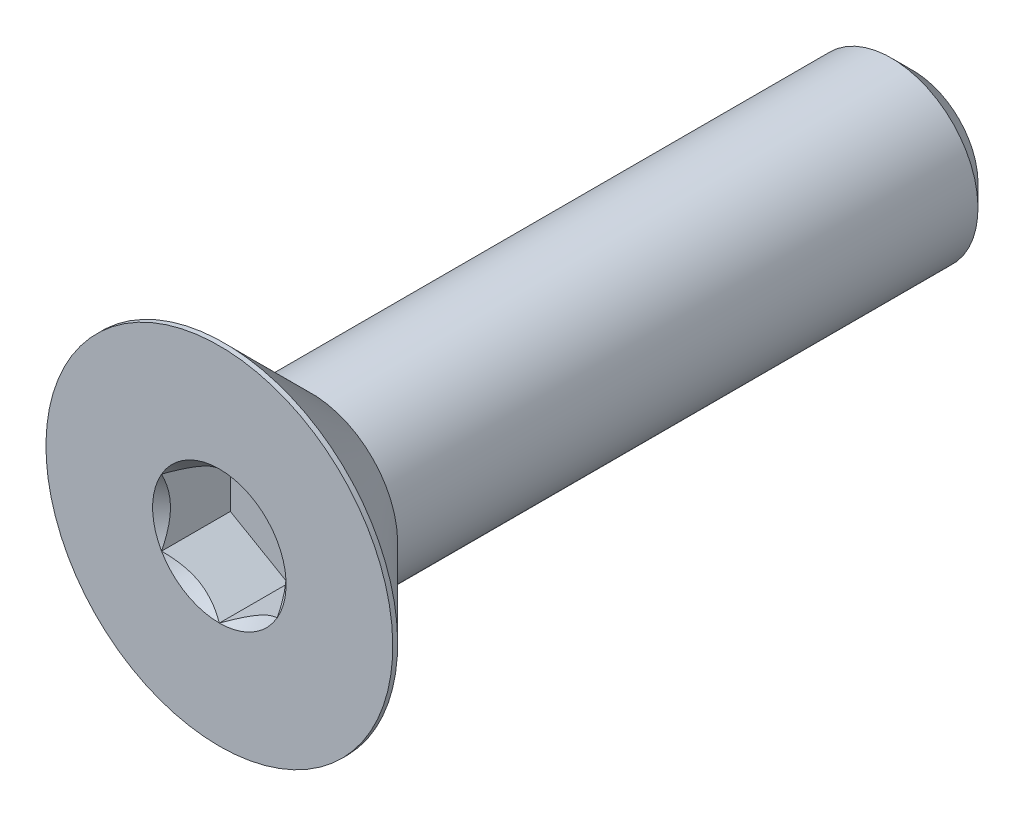
ISO-10303-21;
HEADER;
FILE_DESCRIPTION(('STEP AP214'),'2;1');
FILE_NAME('part.step','',(''),(''),'','','');
FILE_SCHEMA(('AUTOMOTIVE_DESIGN { 1 0 10303 214 1 1 1 1 }'));
ENDSEC;
DATA;
#1=APPLICATION_CONTEXT('core data for automotive mechanical design processes');
#2=APPLICATION_PROTOCOL_DEFINITION('international standard','automotive_design',2000,#1);
#3=PRODUCT_CONTEXT('',#1,'mechanical');
#4=PRODUCT('Part','Part','',(#3));
#5=PRODUCT_RELATED_PRODUCT_CATEGORY('part','',(#4));
#6=PRODUCT_DEFINITION_FORMATION('','',#4);
#7=PRODUCT_DEFINITION_CONTEXT('part definition',#1,'design');
#8=PRODUCT_DEFINITION('design','',#6,#7);
#9=PRODUCT_DEFINITION_SHAPE('','',#8);
#10=(LENGTH_UNIT() NAMED_UNIT(*) SI_UNIT(.MILLI.,.METRE.));
#11=(NAMED_UNIT(*) PLANE_ANGLE_UNIT() SI_UNIT($,.RADIAN.));
#12=(NAMED_UNIT(*) SI_UNIT($,.STERADIAN.) SOLID_ANGLE_UNIT());
#13=UNCERTAINTY_MEASURE_WITH_UNIT(LENGTH_MEASURE(1.E-05),#10,'distance_accuracy_value','');
#14=(GEOMETRIC_REPRESENTATION_CONTEXT(3) GLOBAL_UNCERTAINTY_ASSIGNED_CONTEXT((#13)) GLOBAL_UNIT_ASSIGNED_CONTEXT((#10,
#11,#12)) REPRESENTATION_CONTEXT('',''));
#15=CARTESIAN_POINT('',(0.,0.,0.));
#16=DIRECTION('',(0.,0.,1.));
#17=DIRECTION('',(1.,0.,0.));
#18=AXIS2_PLACEMENT_3D('',#15,#16,#17);
#19=CARTESIAN_POINT('',(0.,0.,5.915));
#20=DIRECTION('',(0.,0.,1.));
#21=DIRECTION('',(0.,-1.,0.));
#22=AXIS2_PLACEMENT_3D('',#19,#20,#21);
#23=CONICAL_SURFACE('',#22,3.,0.785398163397448);
#24=CARTESIAN_POINT('',(0.,0.,5.915));
#25=DIRECTION('',(0.,0.,1.));
#26=DIRECTION('',(0.,-1.,0.));
#27=AXIS2_PLACEMENT_3D('',#24,#25,#26);
#28=CIRCLE('',#27,3.);
#29=CARTESIAN_POINT('',(0.,-3.,5.915));
#30=VERTEX_POINT('',#29);
#31=EDGE_CURVE('E51',#30,#30,#28,.T.);
#32=ORIENTED_EDGE('',*,*,#31,.F.);
#33=EDGE_LOOP('',(#32));
#34=FACE_BOUND('',#33,.T.);
#35=CARTESIAN_POINT('',(0.,0.,4.415));
#36=DIRECTION('',(0.,0.,1.));
#37=DIRECTION('',(0.,-1.,0.));
#38=AXIS2_PLACEMENT_3D('',#35,#36,#37);
#39=CIRCLE('',#38,1.50000000000001);
#40=CARTESIAN_POINT('',(0.,-1.50000000000001,4.415));
#41=VERTEX_POINT('',#40);
#42=EDGE_CURVE('E46',#41,#41,#39,.T.);
#43=ORIENTED_EDGE('',*,*,#42,.T.);
#44=EDGE_LOOP('',(#43));
#45=FACE_BOUND('',#44,.T.);
#46=ADVANCED_FACE('F43',(#34,#45),#23,.T.);
#47=CARTESIAN_POINT('',(0.,0.,6.));
#48=DIRECTION('',(0.,0.,-1.));
#49=DIRECTION('',(0.,1.,0.));
#50=AXIS2_PLACEMENT_3D('',#47,#48,#49);
#51=PLANE('',#50);
#52=CARTESIAN_POINT('',(0.,0.,6.));
#53=DIRECTION('',(0.,0.,1.));
#54=DIRECTION('',(0.,-1.,0.));
#55=AXIS2_PLACEMENT_3D('',#52,#53,#54);
#56=CIRCLE('',#55,3.);
#57=CARTESIAN_POINT('',(0.,-3.,6.));
#58=VERTEX_POINT('',#57);
#59=EDGE_CURVE('E258',#58,#58,#56,.T.);
#60=ORIENTED_EDGE('',*,*,#59,.T.);
#61=EDGE_LOOP('',(#60));
#62=FACE_BOUND('',#61,.T.);
#63=CARTESIAN_POINT('',(0.,0.,6.));
#64=DIRECTION('',(0.,0.,-1.));
#65=DIRECTION('',(-1.,0.,0.));
#66=AXIS2_PLACEMENT_3D('',#63,#64,#65);
#67=CIRCLE('',#66,1.15470053837925);
#68=CARTESIAN_POINT('',(-1.,0.577350269189622,6.));
#69=VERTEX_POINT('',#68);
#70=CARTESIAN_POINT('',(0.,1.15470053837925,6.));
#71=VERTEX_POINT('',#70);
#72=EDGE_CURVE('E133',#69,#71,#67,.T.);
#73=ORIENTED_EDGE('',*,*,#72,.T.);
#74=CARTESIAN_POINT('',(1.,0.577350269189625,6.));
#75=VERTEX_POINT('',#74);
#76=EDGE_CURVE('E132',#71,#75,#67,.T.);
#77=ORIENTED_EDGE('',*,*,#76,.T.);
#78=CARTESIAN_POINT('',(1.,-0.577350269189626,6.));
#79=VERTEX_POINT('',#78);
#80=EDGE_CURVE('E103',#75,#79,#67,.T.);
#81=ORIENTED_EDGE('',*,*,#80,.T.);
#82=CARTESIAN_POINT('',(0.,-1.15470053837925,6.));
#83=VERTEX_POINT('',#82);
#84=EDGE_CURVE('E96',#79,#83,#67,.T.);
#85=ORIENTED_EDGE('',*,*,#84,.T.);
#86=CARTESIAN_POINT('',(-1.,-0.577350269189627,6.));
#87=VERTEX_POINT('',#86);
#88=EDGE_CURVE('E57',#83,#87,#67,.T.);
#89=ORIENTED_EDGE('',*,*,#88,.T.);
#90=EDGE_CURVE('E64',#87,#69,#67,.T.);
#91=ORIENTED_EDGE('',*,*,#90,.T.);
#92=EDGE_LOOP('',(#73,#77,#81,#85,#89,#91));
#93=FACE_BOUND('',#92,.T.);
#94=ADVANCED_FACE('F131',(#62,#93),#51,.F.);
#95=CARTESIAN_POINT('',(0.,0.,6.));
#96=DIRECTION('',(0.,0.,1.));
#97=DIRECTION('',(0.,-1.,0.));
#98=AXIS2_PLACEMENT_3D('',#95,#96,#97);
#99=CYLINDRICAL_SURFACE('',#98,3.);
#100=ORIENTED_EDGE('',*,*,#31,.T.);
#101=EDGE_LOOP('',(#100));
#102=FACE_BOUND('',#101,.T.);
#103=ORIENTED_EDGE('',*,*,#59,.F.);
#104=EDGE_LOOP('',(#103));
#105=FACE_BOUND('',#104,.T.);
#106=ADVANCED_FACE('F214',(#102,#105),#99,.T.);
#107=CARTESIAN_POINT('',(0.,0.,6.));
#108=DIRECTION('',(0.,0.,1.));
#109=DIRECTION('',(-1.,0.,0.));
#110=AXIS2_PLACEMENT_3D('',#107,#108,#109);
#111=CONICAL_SURFACE('',#110,1.15470053837925,0.78539816339745);
#112=CARTESIAN_POINT('',(1.,-1.15147208663215,6.37038567764035));
#113=CARTESIAN_POINT('',(1.,-1.12343448004835,6.34921991999533));
#114=CARTESIAN_POINT('',(1.,-1.09524064866509,6.32826169229267));
#115=CARTESIAN_POINT('',(1.,-1.0384771565924,6.28684602234268));
#116=CARTESIAN_POINT('',(1.,-1.00990740397363,6.26638870622588));
#117=CARTESIAN_POINT('',(1.,-0.923120894462778,6.20560479504213));
#118=CARTESIAN_POINT('',(1.,-0.864253173878447,6.16619222903932));
#119=CARTESIAN_POINT('',(1.,-0.740809858355813,6.08882066425819));
#120=CARTESIAN_POINT('',(1.,-0.67610025522381,6.05107303916216));
#121=CARTESIAN_POINT('',(1.,-0.543448939110599,5.98202458758025));
#122=CARTESIAN_POINT('',(1.,-0.475519112076497,5.95070202786713));
#123=CARTESIAN_POINT('',(1.,-0.373555850372649,5.9123817788976));
#124=CARTESIAN_POINT('',(1.,-0.341031989714047,5.90138359165621));
#125=CARTESIAN_POINT('',(1.,-0.275199079103602,5.88199834216111));
#126=CARTESIAN_POINT('',(1.,-0.241889975229392,5.87361145978989));
#127=CARTESIAN_POINT('',(1.,-0.175247517106615,5.86002522073014));
#128=CARTESIAN_POINT('',(1.,-0.141925568285808,5.85477079077761));
#129=CARTESIAN_POINT('',(1.,-0.0749144363078012,5.84754868657667));
#130=CARTESIAN_POINT('',(1.,-0.0412251979295628,5.8455815136139));
#131=CARTESIAN_POINT('',(1.,0.0249580991768643,5.84508319839111));
#132=CARTESIAN_POINT('',(1.,0.0574512825561959,5.84643026788357));
#133=CARTESIAN_POINT('',(1.,0.122148505605779,5.85221648448742));
#134=CARTESIAN_POINT('',(1.,0.154352610033881,5.85665492064648));
#135=CARTESIAN_POINT('',(1.,0.218799898762755,5.86845683012285));
#136=CARTESIAN_POINT('',(1.,0.251033743161196,5.87587054101231));
#137=CARTESIAN_POINT('',(1.,0.314797132241694,5.89322894246471));
#138=CARTESIAN_POINT('',(1.,0.346326735615184,5.90317342125094));
#139=CARTESIAN_POINT('',(1.,0.445594187589165,5.93822348249794));
#140=CARTESIAN_POINT('',(1.,0.511919139313636,5.9673208582833));
#141=CARTESIAN_POINT('',(1.,0.64145324445405,6.03201532957714));
#142=CARTESIAN_POINT('',(1.,0.704650132903152,6.06763577658696));
#143=CARTESIAN_POINT('',(1.,0.825428489916357,6.14112390118245));
#144=CARTESIAN_POINT('',(1.,0.883132947593202,6.17879194695385));
#145=CARTESIAN_POINT('',(1.,0.968148853406642,6.23702285273595));
#146=CARTESIAN_POINT('',(1.,0.996120570074661,6.25663847554718));
#147=CARTESIAN_POINT('',(1.,1.05168177697804,6.29638851682867));
#148=CARTESIAN_POINT('',(1.,1.07927136964838,6.31652279195777));
#149=CARTESIAN_POINT('',(1.,1.10670185312703,6.33687211882347));
#150=B_SPLINE_CURVE_WITH_KNOTS('',3,(#112,#113,#114,#115,#116,#117,#118,#119,#120,#121,#122,
#123,#124,#125,#126,#127,#128,#129,#130,#131,#132,#133,#134,#135,#136,#137,#138,#139,#140,#141,
#142,#143,#144,#145,#146,#147,#148,#149),.UNSPECIFIED.,.F.,.F.,(4,2,2,2,2,2,2,2,2,2,2,2,2,2,2,2,
2,2,4),(0.,0.10538645910335,0.210799187370249,0.423233611646474,0.647793541035353,
0.871580877910868,0.974493074342057,1.07741235842105,1.17846428216996,1.2795316142844,
1.3769408675127,1.47432772596047,1.57343322813835,1.67253043981296,1.88917353997386,
2.10660791031434,2.31323734235672,2.41572589214524,2.51818641455633),.UNSPECIFIED.);
#151=EDGE_CURVE('E11',#75,#79,#150,.F.);
#152=ORIENTED_EDGE('',*,*,#151,.T.);
#153=ORIENTED_EDGE('',*,*,#80,.F.);
#154=EDGE_LOOP('',(#152,#153));
#155=FACE_BOUND('',#154,.T.);
#156=ADVANCED_FACE('F108',(#155),#111,.F.);
#157=CARTESIAN_POINT('',(-0.000199999999999653,1.15481600843309,6.00011548737261));
#158=CARTESIAN_POINT('',(0.0341825950071809,1.13496520795026,5.98027793082573));
#159=CARTESIAN_POINT('',(0.0691401181398251,1.11478247255942,5.96160502063888));
#160=CARTESIAN_POINT('',(0.14042280295609,1.07362739529219,5.92741474272315));
#161=CARTESIAN_POINT('',(0.176754750528985,1.0526511355808,5.91191640902345));
#162=CARTESIAN_POINT('',(0.250016613803312,1.01035337909803,5.88536730714226));
#163=CARTESIAN_POINT('',(0.286927851445415,0.98904266610924,5.87424977399692));
#164=CARTESIAN_POINT('',(0.36156272931086,0.945952199282691,5.85711986577618));
#165=CARTESIAN_POINT('',(0.399284088108636,0.924173762626596,5.85109469746667));
#166=CARTESIAN_POINT('',(0.464292198417934,0.886641312640014,5.84566055496749));
#167=CARTESIAN_POINT('',(0.491494371528173,0.870936130672275,5.84485693831673));
#168=CARTESIAN_POINT('',(0.545846040669113,0.839556179862848,5.84620669941688));
#169=CARTESIAN_POINT('',(0.572995523754877,0.823881418494923,5.8483607295472));
#170=CARTESIAN_POINT('',(0.654056277326961,0.777080970599366,5.85911697212847));
#171=CARTESIAN_POINT('',(0.707564140978428,0.74618819111643,5.87201455641535));
#172=CARTESIAN_POINT('',(0.801476065143433,0.691968116419649,5.90314073060217));
#173=CARTESIAN_POINT('',(0.842320523671835,0.668386557293371,5.91973779770184));
#174=CARTESIAN_POINT('',(0.922409637381945,0.622147085933681,5.95712492468529));
#175=CARTESIAN_POINT('',(0.961659010870439,0.599486449584575,5.9779013418174));
#176=CARTESIAN_POINT('',(1.0002,0.577234799135787,6.00011548737261));
#177=B_SPLINE_CURVE_WITH_KNOTS('',3,(#157,#158,#159,#160,#161,#162,#163,#164,#165,#166,#167,
#168,#169,#170,#171,#172,#173,#174,#175,#176),.UNSPECIFIED.,.F.,.F.,(4,2,2,2,2,2,2,2,2,4),(0.,
0.133237676828559,0.26725222983449,0.3991370762693,0.530689603280768,0.624814864263846,
0.718960890149133,0.907306626112098,1.05710100361789,1.20641411519286),.UNSPECIFIED.);
#178=EDGE_CURVE('E136',#71,#75,#177,.T.);
#179=ORIENTED_EDGE('',*,*,#178,.T.);
#180=ORIENTED_EDGE('',*,*,#76,.F.);
#181=EDGE_LOOP('',(#179,#180));
#182=FACE_BOUND('',#181,.T.);
#183=ADVANCED_FACE('F254',(#182),#111,.F.);
#184=CARTESIAN_POINT('',(-1.0002,0.577234799135787,6.00011548737261));
#185=CARTESIAN_POINT('',(-0.96581740499282,0.59708559961862,5.98027793082573));
#186=CARTESIAN_POINT('',(-0.930859881860176,0.617268335009455,5.96160502063889));
#187=CARTESIAN_POINT('',(-0.859577197043911,0.658423412276685,5.92741474272315));
#188=CARTESIAN_POINT('',(-0.823245249471017,0.679399671988079,5.91191640902345));
#189=CARTESIAN_POINT('',(-0.74998338619669,0.721697428470845,5.88536730714226));
#190=CARTESIAN_POINT('',(-0.713072148554586,0.743008141459636,5.87424977399692));
#191=CARTESIAN_POINT('',(-0.638437270689141,0.786098608286185,5.85711986577618));
#192=CARTESIAN_POINT('',(-0.600715911891364,0.80787704494228,5.85109469746667));
#193=CARTESIAN_POINT('',(-0.535707801582067,0.845409494928862,5.84566055496749));
#194=CARTESIAN_POINT('',(-0.508505628471828,0.861114676896601,5.84485693831673));
#195=CARTESIAN_POINT('',(-0.454153959330888,0.892494627706028,5.84620669941688));
#196=CARTESIAN_POINT('',(-0.427004476245124,0.908169389073953,5.84836072954719));
#197=CARTESIAN_POINT('',(-0.34594372267304,0.95496983696951,5.85911697212847));
#198=CARTESIAN_POINT('',(-0.292435859021573,0.985862616452446,5.87201455641535));
#199=CARTESIAN_POINT('',(-0.198523934856569,1.04008269114923,5.90314073060217));
#200=CARTESIAN_POINT('',(-0.157679476328166,1.06366425027551,5.91973779770183));
#201=CARTESIAN_POINT('',(-0.0775903626180563,1.1099037216352,5.95712492468529));
#202=CARTESIAN_POINT('',(-0.0383409891295621,1.1325643579843,5.9779013418174));
#203=CARTESIAN_POINT('',(0.00020000000000031,1.15481600843309,6.00011548737261));
#204=B_SPLINE_CURVE_WITH_KNOTS('',3,(#184,#185,#186,#187,#188,#189,#190,#191,#192,#193,#194,
#195,#196,#197,#198,#199,#200,#201,#202,#203),.UNSPECIFIED.,.F.,.F.,(4,2,2,2,2,2,2,2,2,4),(0.,
0.13323767682856,0.267252229834491,0.399137076269301,0.53068960328077,0.624814864263848,
0.718960890149135,0.907306626112099,1.0571010036179,1.20641411519286),.UNSPECIFIED.);
#205=EDGE_CURVE('E146',#69,#71,#204,.T.);
#206=ORIENTED_EDGE('',*,*,#205,.T.);
#207=ORIENTED_EDGE('',*,*,#72,.F.);
#208=EDGE_LOOP('',(#206,#207));
#209=FACE_BOUND('',#208,.T.);
#210=ADVANCED_FACE('F290',(#209),#111,.F.);
#211=CARTESIAN_POINT('',(-1.,-1.15147208646462,6.37038567751386));
#212=CARTESIAN_POINT('',(-1.,-1.12343447988552,6.34921991987371));
#213=CARTESIAN_POINT('',(-1.,-1.09524064850698,6.32826169217591));
#214=CARTESIAN_POINT('',(-1.,-1.03847715644377,6.28684602223562));
#215=CARTESIAN_POINT('',(-1.,-1.00990740382975,6.26638870612366));
#216=CARTESIAN_POINT('',(-1.,-0.923120894333482,6.20560479495451));
#217=CARTESIAN_POINT('',(-1.,-0.864253173759064,6.1661922289614));
#218=CARTESIAN_POINT('',(-1.,-0.740809858258049,6.08882066420021));
#219=CARTESIAN_POINT('',(-1.,-0.676100255137811,6.05107303911434));
#220=CARTESIAN_POINT('',(-1.,-0.543448939049128,5.98202458755129));
#221=CARTESIAN_POINT('',(-1.,-0.475519112027782,5.95070202784686));
#222=CARTESIAN_POINT('',(-1.,-0.373555850333531,5.91238177888379));
#223=CARTESIAN_POINT('',(-1.,-0.34103198967091,5.90138359164215));
#224=CARTESIAN_POINT('',(-1.,-0.275199079052295,5.88199834214736));
#225=CARTESIAN_POINT('',(-1.,-0.241889975173935,5.8736114597767));
#226=CARTESIAN_POINT('',(-1.,-0.175247517042994,5.86002522071901));
#227=CARTESIAN_POINT('',(-1.,-0.141925568218176,5.85477079076796));
#228=CARTESIAN_POINT('',(-1.,-0.0749144362322803,5.84754868657089));
#229=CARTESIAN_POINT('',(-1.,-0.041225197850163,5.8455815136105));
#230=CARTESIAN_POINT('',(-1.,0.0249580992634199,5.84508319839316));
#231=CARTESIAN_POINT('',(-1.,0.0574512826460382,5.84643026788863));
#232=CARTESIAN_POINT('',(-1.,0.122148505701866,5.85221648449898));
#233=CARTESIAN_POINT('',(-1.,0.154352610132926,5.85665492066153));
#234=CARTESIAN_POINT('',(-1.,0.218799898867639,5.8684568301452));
#235=CARTESIAN_POINT('',(-1.,0.251033743268953,5.87587054103851));
#236=CARTESIAN_POINT('',(-1.,0.314797132354919,5.89322894249867));
#237=CARTESIAN_POINT('',(-1.,0.346326735731004,5.90317342128883));
#238=CARTESIAN_POINT('',(-1.,0.445594187730205,5.93822348255433));
#239=CARTESIAN_POINT('',(-1.,0.511919139476036,5.96732085835672));
#240=CARTESIAN_POINT('',(-1.,0.641453244657532,6.0320153296865));
#241=CARTESIAN_POINT('',(-1.,0.704650133126344,6.06763577671524));
#242=CARTESIAN_POINT('',(-1.,0.825428490174986,6.14112390134693));
#243=CARTESIAN_POINT('',(-1.,0.883132947867684,6.17879194713546));
#244=CARTESIAN_POINT('',(-1.,0.968148853704564,6.23702285294316));
#245=CARTESIAN_POINT('',(-1.,0.996120570380284,6.25663847576285));
#246=CARTESIAN_POINT('',(-1.,1.05168177729901,6.29638851706127));
#247=CARTESIAN_POINT('',(-1.,1.079271369977,6.31652279219883));
#248=CARTESIAN_POINT('',(-1.,1.10670185346329,6.33687211907297));
#249=B_SPLINE_CURVE_WITH_KNOTS('',3,(#211,#212,#213,#214,#215,#216,#217,#218,#219,#220,#221,
#222,#223,#224,#225,#226,#227,#228,#229,#230,#231,#232,#233,#234,#235,#236,#237,#238,#239,#240,
#241,#242,#243,#244,#245,#246,#247,#248),.UNSPECIFIED.,.F.,.F.,(4,2,2,2,2,2,2,2,2,2,2,2,2,2,2,2,
2,2,4),(0.,0.105386459083291,0.210799187330126,0.423233611565471,0.647793540908506,
0.871580877738614,0.974493074181426,1.07741235827202,1.17846428203205,1.27953161415763,
1.37694086739611,1.47432772585408,1.57343322804294,1.67253043972852,1.88917353996828,
2.10660791038813,2.31323734249844,2.41572589232045,2.51818641476504),.UNSPECIFIED.);
#250=EDGE_CURVE('E175',#87,#69,#249,.T.);
#251=ORIENTED_EDGE('',*,*,#250,.T.);
#252=ORIENTED_EDGE('',*,*,#90,.F.);
#253=EDGE_LOOP('',(#251,#252));
#254=FACE_BOUND('',#253,.T.);
#255=ADVANCED_FACE('F298',(#254),#111,.F.);
#256=CARTESIAN_POINT('',(0.000199999999999535,-1.15481600843309,6.00011548737261));
#257=CARTESIAN_POINT('',(-0.034182595007181,-1.13496520795026,5.98027793082573));
#258=CARTESIAN_POINT('',(-0.0691401181398253,-1.11478247255942,5.96160502063889));
#259=CARTESIAN_POINT('',(-0.14042280295609,-1.07362739529219,5.92741474272316));
#260=CARTESIAN_POINT('',(-0.176754750528985,-1.0526511355808,5.91191640902346));
#261=CARTESIAN_POINT('',(-0.250016613803312,-1.01035337909803,5.88536730714227));
#262=CARTESIAN_POINT('',(-0.286927851445416,-0.989042666109244,5.87424977399693));
#263=CARTESIAN_POINT('',(-0.361562729310861,-0.945952199282694,5.85711986577618));
#264=CARTESIAN_POINT('',(-0.399284088108637,-0.924173762626599,5.85109469746667));
#265=CARTESIAN_POINT('',(-0.464292198417935,-0.886641312640017,5.84566055496749));
#266=CARTESIAN_POINT('',(-0.491494371528174,-0.870936130672278,5.84485693831673));
#267=CARTESIAN_POINT('',(-0.545846040669114,-0.839556179862851,5.84620669941689));
#268=CARTESIAN_POINT('',(-0.572995523754878,-0.823881418494926,5.8483607295472));
#269=CARTESIAN_POINT('',(-0.654056277326963,-0.777080970599369,5.85911697212847));
#270=CARTESIAN_POINT('',(-0.70756414097843,-0.746188191116432,5.87201455641536));
#271=CARTESIAN_POINT('',(-0.801476065143434,-0.691968116419652,5.90314073060218));
#272=CARTESIAN_POINT('',(-0.842320523671837,-0.668386557293374,5.91973779770184));
#273=CARTESIAN_POINT('',(-0.922409637381945,-0.622147085933684,5.95712492468529));
#274=CARTESIAN_POINT('',(-0.961659010870439,-0.599486449584578,5.9779013418174));
#275=CARTESIAN_POINT('',(-1.0002,-0.577234799135791,6.00011548737261));
#276=B_SPLINE_CURVE_WITH_KNOTS('',3,(#256,#257,#258,#259,#260,#261,#262,#263,#264,#265,#266,
#267,#268,#269,#270,#271,#272,#273,#274,#275),.UNSPECIFIED.,.F.,.F.,(4,2,2,2,2,2,2,2,2,4),(0.,
0.133237676828559,0.267252229834491,0.399137076269301,0.530689603280769,0.624814864263848,
0.718960890149135,0.9073066261121,1.0571010036179,1.20641411519286),.UNSPECIFIED.);
#277=EDGE_CURVE('E120',#83,#87,#276,.T.);
#278=ORIENTED_EDGE('',*,*,#277,.T.);
#279=ORIENTED_EDGE('',*,*,#88,.F.);
#280=EDGE_LOOP('',(#278,#279));
#281=FACE_BOUND('',#280,.T.);
#282=ADVANCED_FACE('F161',(#281),#111,.F.);
#283=CARTESIAN_POINT('',(1.0002,-0.577234799135789,6.00011548737261));
#284=CARTESIAN_POINT('',(0.965817404992822,-0.597085599618623,5.98027793082573));
#285=CARTESIAN_POINT('',(0.930859881860177,-0.617268335009457,5.96160502063889));
#286=CARTESIAN_POINT('',(0.859577197043913,-0.658423412276687,5.92741474272316));
#287=CARTESIAN_POINT('',(0.823245249471018,-0.679399671988081,5.91191640902346));
#288=CARTESIAN_POINT('',(0.749983386196691,-0.721697428470848,5.88536730714226));
#289=CARTESIAN_POINT('',(0.713072148554588,-0.743008141459638,5.87424977399693));
#290=CARTESIAN_POINT('',(0.638437270689143,-0.786098608286187,5.85711986577618));
#291=CARTESIAN_POINT('',(0.600715911891367,-0.807877044942282,5.85109469746667));
#292=CARTESIAN_POINT('',(0.535707801582069,-0.845409494928864,5.84566055496749));
#293=CARTESIAN_POINT('',(0.50850562847183,-0.861114676896603,5.84485693831673));
#294=CARTESIAN_POINT('',(0.45415395933089,-0.892494627706031,5.84620669941689));
#295=CARTESIAN_POINT('',(0.427004476245127,-0.908169389073956,5.8483607295472));
#296=CARTESIAN_POINT('',(0.345943722673042,-0.954969836969513,5.85911697212847));
#297=CARTESIAN_POINT('',(0.292435859021575,-0.985862616452449,5.87201455641535));
#298=CARTESIAN_POINT('',(0.19852393485657,-1.04008269114923,5.90314073060218));
#299=CARTESIAN_POINT('',(0.157679476328167,-1.06366425027551,5.91973779770184));
#300=CARTESIAN_POINT('',(0.0775903626180568,-1.1099037216352,5.95712492468529));
#301=CARTESIAN_POINT('',(0.0383409891295625,-1.13256435798431,5.9779013418174));
#302=CARTESIAN_POINT('',(-0.000200000000000121,-1.15481600843309,6.00011548737261));
#303=B_SPLINE_CURVE_WITH_KNOTS('',3,(#283,#284,#285,#286,#287,#288,#289,#290,#291,#292,#293,
#294,#295,#296,#297,#298,#299,#300,#301,#302),.UNSPECIFIED.,.F.,.F.,(4,2,2,2,2,2,2,2,2,4),(0.,
0.133237676828559,0.26725222983449,0.3991370762693,0.530689603280768,0.624814864263846,
0.718960890149133,0.907306626112098,1.0571010036179,1.20641411519286),.UNSPECIFIED.);
#304=EDGE_CURVE('E99',#79,#83,#303,.T.);
#305=ORIENTED_EDGE('',*,*,#304,.T.);
#306=ORIENTED_EDGE('',*,*,#84,.F.);
#307=EDGE_LOOP('',(#305,#306));
#308=FACE_BOUND('',#307,.T.);
#309=ADVANCED_FACE('F97',(#308),#111,.F.);
#310=CARTESIAN_POINT('',(1.,-0.577350269189627,4.81));
#311=DIRECTION('',(0.,0.,1.));
#312=DIRECTION('',(1.,0.,0.));
#313=AXIS2_PLACEMENT_3D('',#310,#311,#312);
#314=PLANE('',#313);
#315=DIRECTION('',(0.866025403784438,0.5,0.));
#316=VECTOR('',#315,1.);
#317=CARTESIAN_POINT('',(0.,-1.15470053837926,4.81));
#318=LINE('',#317,#316);
#319=CARTESIAN_POINT('',(0.,-1.15470053837926,4.81));
#320=VERTEX_POINT('',#319);
#321=CARTESIAN_POINT('',(1.,-0.577350269189627,4.81));
#322=VERTEX_POINT('',#321);
#323=EDGE_CURVE('E119',#320,#322,#318,.T.);
#324=ORIENTED_EDGE('',*,*,#323,.T.);
#325=DIRECTION('',(0.,1.,0.));
#326=VECTOR('',#325,1.);
#327=CARTESIAN_POINT('',(1.,-0.577350269189627,4.81));
#328=LINE('',#327,#326);
#329=CARTESIAN_POINT('',(1.,0.577350269189625,4.81));
#330=VERTEX_POINT('',#329);
#331=EDGE_CURVE('E124',#322,#330,#328,.T.);
#332=ORIENTED_EDGE('',*,*,#331,.T.);
#333=DIRECTION('',(-0.866025403784439,0.5,0.));
#334=VECTOR('',#333,1.);
#335=CARTESIAN_POINT('',(1.,0.577350269189625,4.81));
#336=LINE('',#335,#334);
#337=CARTESIAN_POINT('',(0.,1.15470053837925,4.81));
#338=VERTEX_POINT('',#337);
#339=EDGE_CURVE('E280',#330,#338,#336,.T.);
#340=ORIENTED_EDGE('',*,*,#339,.T.);
#341=DIRECTION('',(-0.866025403784438,-0.5,0.));
#342=VECTOR('',#341,1.);
#343=CARTESIAN_POINT('',(0.,1.15470053837925,4.81));
#344=LINE('',#343,#342);
#345=CARTESIAN_POINT('',(-1.,0.577350269189624,4.81));
#346=VERTEX_POINT('',#345);
#347=EDGE_CURVE('E277',#338,#346,#344,.T.);
#348=ORIENTED_EDGE('',*,*,#347,.T.);
#349=DIRECTION('',(0.,-1.,0.));
#350=VECTOR('',#349,1.);
#351=CARTESIAN_POINT('',(-1.,0.577350269189624,4.81));
#352=LINE('',#351,#350);
#353=CARTESIAN_POINT('',(-1.,-0.577350269189629,4.81));
#354=VERTEX_POINT('',#353);
#355=EDGE_CURVE('E274',#346,#354,#352,.T.);
#356=ORIENTED_EDGE('',*,*,#355,.T.);
#357=DIRECTION('',(0.866025403784439,-0.5,0.));
#358=VECTOR('',#357,1.);
#359=CARTESIAN_POINT('',(-1.,-0.577350269189629,4.81));
#360=LINE('',#359,#358);
#361=EDGE_CURVE('E127',#354,#320,#360,.T.);
#362=ORIENTED_EDGE('',*,*,#361,.T.);
#363=EDGE_LOOP('',(#324,#332,#340,#348,#356,#362));
#364=FACE_BOUND('',#363,.T.);
#365=ADVANCED_FACE('F160',(#364),#314,.T.);
#366=CARTESIAN_POINT('',(1.,-0.577350269189627,4.81));
#367=DIRECTION('',(1.,0.,0.));
#368=DIRECTION('',(0.,1.,0.));
#369=AXIS2_PLACEMENT_3D('',#366,#367,#368);
#370=PLANE('',#369);
#371=ORIENTED_EDGE('',*,*,#151,.F.);
#372=DIRECTION('',(0.,0.,1.));
#373=VECTOR('',#372,1.);
#374=CARTESIAN_POINT('',(1.,0.577350269189625,4.81));
#375=LINE('',#374,#373);
#376=EDGE_CURVE('E126',#330,#75,#375,.T.);
#377=ORIENTED_EDGE('',*,*,#376,.F.);
#378=ORIENTED_EDGE('',*,*,#331,.F.);
#379=DIRECTION('',(0.,0.,1.));
#380=VECTOR('',#379,1.);
#381=CARTESIAN_POINT('',(1.,-0.577350269189627,4.81));
#382=LINE('',#381,#380);
#383=EDGE_CURVE('E116',#322,#79,#382,.T.);
#384=ORIENTED_EDGE('',*,*,#383,.T.);
#385=EDGE_LOOP('',(#371,#377,#378,#384));
#386=FACE_BOUND('',#385,.T.);
#387=ADVANCED_FACE('F122',(#386),#370,.F.);
#388=CARTESIAN_POINT('',(1.,0.577350269189625,4.81));
#389=DIRECTION('',(0.5,0.866025403784439,0.));
#390=DIRECTION('',(-0.866025403784439,0.5,0.));
#391=AXIS2_PLACEMENT_3D('',#388,#389,#390);
#392=PLANE('',#391);
#393=ORIENTED_EDGE('',*,*,#178,.F.);
#394=DIRECTION('',(0.,0.,1.));
#395=VECTOR('',#394,1.);
#396=CARTESIAN_POINT('',(0.,1.15470053837925,4.81));
#397=LINE('',#396,#395);
#398=EDGE_CURVE('E264',#338,#71,#397,.T.);
#399=ORIENTED_EDGE('',*,*,#398,.F.);
#400=ORIENTED_EDGE('',*,*,#339,.F.);
#401=ORIENTED_EDGE('',*,*,#376,.T.);
#402=EDGE_LOOP('',(#393,#399,#400,#401));
#403=FACE_BOUND('',#402,.T.);
#404=ADVANCED_FACE('F153',(#403),#392,.F.);
#405=CARTESIAN_POINT('',(0.,1.15470053837925,4.81));
#406=DIRECTION('',(-0.5,0.866025403784439,0.));
#407=DIRECTION('',(-0.866025403784439,-0.5,0.));
#408=AXIS2_PLACEMENT_3D('',#405,#406,#407);
#409=PLANE('',#408);
#410=ORIENTED_EDGE('',*,*,#205,.F.);
#411=DIRECTION('',(0.,0.,1.));
#412=VECTOR('',#411,1.);
#413=CARTESIAN_POINT('',(-1.,0.577350269189624,4.81));
#414=LINE('',#413,#412);
#415=EDGE_CURVE('E267',#346,#69,#414,.T.);
#416=ORIENTED_EDGE('',*,*,#415,.F.);
#417=ORIENTED_EDGE('',*,*,#347,.F.);
#418=ORIENTED_EDGE('',*,*,#398,.T.);
#419=EDGE_LOOP('',(#410,#416,#417,#418));
#420=FACE_BOUND('',#419,.T.);
#421=ADVANCED_FACE('F199',(#420),#409,.F.);
#422=CARTESIAN_POINT('',(-1.,0.577350269189624,4.81));
#423=DIRECTION('',(-1.,0.,0.));
#424=DIRECTION('',(0.,-1.,0.));
#425=AXIS2_PLACEMENT_3D('',#422,#423,#424);
#426=PLANE('',#425);
#427=ORIENTED_EDGE('',*,*,#250,.F.);
#428=DIRECTION('',(0.,0.,1.));
#429=VECTOR('',#428,1.);
#430=CARTESIAN_POINT('',(-1.,-0.577350269189629,4.81));
#431=LINE('',#430,#429);
#432=EDGE_CURVE('E260',#354,#87,#431,.T.);
#433=ORIENTED_EDGE('',*,*,#432,.F.);
#434=ORIENTED_EDGE('',*,*,#355,.F.);
#435=ORIENTED_EDGE('',*,*,#415,.T.);
#436=EDGE_LOOP('',(#427,#433,#434,#435));
#437=FACE_BOUND('',#436,.T.);
#438=ADVANCED_FACE('F195',(#437),#426,.F.);
#439=CARTESIAN_POINT('',(-1.,-0.577350269189629,4.81));
#440=DIRECTION('',(-0.5,-0.866025403784439,0.));
#441=DIRECTION('',(0.866025403784439,-0.5,0.));
#442=AXIS2_PLACEMENT_3D('',#439,#440,#441);
#443=PLANE('',#442);
#444=ORIENTED_EDGE('',*,*,#277,.F.);
#445=DIRECTION('',(0.,0.,1.));
#446=VECTOR('',#445,1.);
#447=CARTESIAN_POINT('',(0.,-1.15470053837926,4.81));
#448=LINE('',#447,#446);
#449=EDGE_CURVE('E118',#320,#83,#448,.T.);
#450=ORIENTED_EDGE('',*,*,#449,.F.);
#451=ORIENTED_EDGE('',*,*,#361,.F.);
#452=ORIENTED_EDGE('',*,*,#432,.T.);
#453=EDGE_LOOP('',(#444,#450,#451,#452));
#454=FACE_BOUND('',#453,.T.);
#455=ADVANCED_FACE('F192',(#454),#443,.F.);
#456=CARTESIAN_POINT('',(0.,-1.15470053837926,4.81));
#457=DIRECTION('',(0.5,-0.866025403784438,0.));
#458=DIRECTION('',(0.866025403784439,0.5,0.));
#459=AXIS2_PLACEMENT_3D('',#456,#457,#458);
#460=PLANE('',#459);
#461=ORIENTED_EDGE('',*,*,#304,.F.);
#462=ORIENTED_EDGE('',*,*,#383,.F.);
#463=ORIENTED_EDGE('',*,*,#323,.F.);
#464=ORIENTED_EDGE('',*,*,#449,.T.);
#465=EDGE_LOOP('',(#461,#462,#463,#464));
#466=FACE_BOUND('',#465,.T.);
#467=ADVANCED_FACE('F114',(#466),#460,.F.);
#468=CARTESIAN_POINT('',(0.,-1.5,-6.00000000000001));
#469=DIRECTION('',(0.,0.,1.));
#470=DIRECTION('',(0.,-1.,0.));
#471=AXIS2_PLACEMENT_3D('',#468,#469,#470);
#472=PLANE('',#471);
#473=CARTESIAN_POINT('',(0.,0.,-6.00000000000001));
#474=DIRECTION('',(0.,0.,1.));
#475=DIRECTION('',(0.,-1.,0.));
#476=AXIS2_PLACEMENT_3D('',#473,#474,#475);
#477=CIRCLE('',#476,1.125);
#478=CARTESIAN_POINT('',(0.,-1.125,-6.00000000000001));
#479=VERTEX_POINT('',#478);
#480=EDGE_CURVE('E137',#479,#479,#477,.F.);
#481=ORIENTED_EDGE('',*,*,#480,.T.);
#482=EDGE_LOOP('',(#481));
#483=FACE_BOUND('',#482,.T.);
#484=ADVANCED_FACE('F237',(#483),#472,.F.);
#485=CARTESIAN_POINT('',(0.,0.,4.81));
#486=DIRECTION('',(0.,0.,1.));
#487=DIRECTION('',(0.,-1.,0.));
#488=AXIS2_PLACEMENT_3D('',#485,#486,#487);
#489=CYLINDRICAL_SURFACE('',#488,1.50000000000001);
#490=ORIENTED_EDGE('',*,*,#42,.F.);
#491=EDGE_LOOP('',(#490));
#492=FACE_BOUND('',#491,.T.);
#493=CARTESIAN_POINT('',(0.,0.,-5.625));
#494=DIRECTION('',(0.,0.,1.));
#495=DIRECTION('',(0.,-1.,0.));
#496=AXIS2_PLACEMENT_3D('',#493,#494,#495);
#497=CIRCLE('',#496,1.50000000000001);
#498=CARTESIAN_POINT('',(0.,-1.50000000000001,-5.625));
#499=VERTEX_POINT('',#498);
#500=EDGE_CURVE('E224',#499,#499,#497,.T.);
#501=ORIENTED_EDGE('',*,*,#500,.T.);
#502=EDGE_LOOP('',(#501));
#503=FACE_BOUND('',#502,.T.);
#504=ADVANCED_FACE('F230',(#492,#503),#489,.T.);
#505=CARTESIAN_POINT('',(0.,0.,-5.625));
#506=DIRECTION('',(0.,0.,1.));
#507=DIRECTION('',(0.,-1.,0.));
#508=AXIS2_PLACEMENT_3D('',#505,#506,#507);
#509=CONICAL_SURFACE('',#508,1.50000000000001,0.785398163397452);
#510=ORIENTED_EDGE('',*,*,#480,.F.);
#511=EDGE_LOOP('',(#510));
#512=FACE_BOUND('',#511,.T.);
#513=ORIENTED_EDGE('',*,*,#500,.F.);
#514=EDGE_LOOP('',(#513));
#515=FACE_BOUND('',#514,.T.);
#516=ADVANCED_FACE('F162',(#512,#515),#509,.T.);
#517=CLOSED_SHELL('',(#46,#94,#106,#156,#183,#210,#255,#282,#309,#365,#387,#404,#421,#438,#455,
#467,#484,#504,#516));
#518=MANIFOLD_SOLID_BREP('B2',#517);
#519=ADVANCED_BREP_SHAPE_REPRESENTATION('',(#18,#518),#14);
#520=SHAPE_DEFINITION_REPRESENTATION(#9,#519);
ENDSEC;
END-ISO-10303-21;
